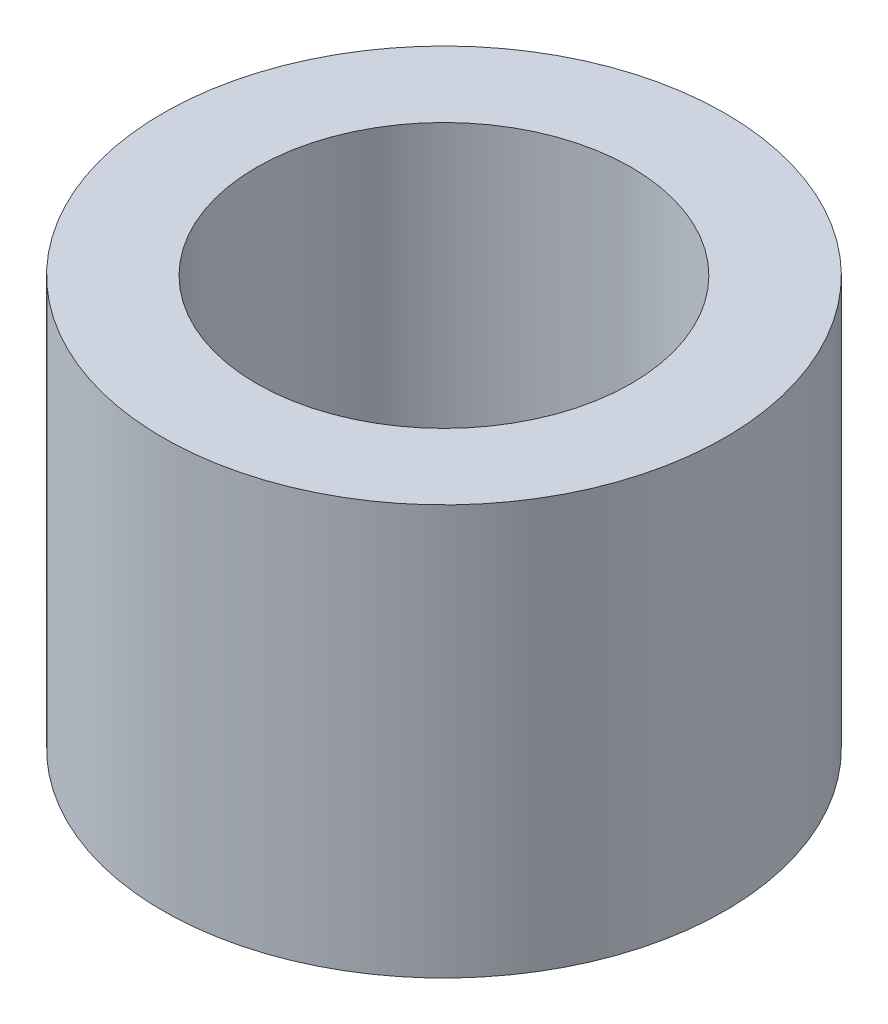
ISO-10303-21;
HEADER;
FILE_DESCRIPTION(('STEP AP214'),'2;1');
FILE_NAME('part.step','',(''),(''),'','','');
FILE_SCHEMA(('AUTOMOTIVE_DESIGN { 1 0 10303 214 1 1 1 1 }'));
ENDSEC;
DATA;
#1=APPLICATION_CONTEXT('core data for automotive mechanical design processes');
#2=APPLICATION_PROTOCOL_DEFINITION('international standard','automotive_design',2000,#1);
#3=PRODUCT_CONTEXT('',#1,'mechanical');
#4=PRODUCT('Part','Part','',(#3));
#5=PRODUCT_RELATED_PRODUCT_CATEGORY('part','',(#4));
#6=PRODUCT_DEFINITION_FORMATION('','',#4);
#7=PRODUCT_DEFINITION_CONTEXT('part definition',#1,'design');
#8=PRODUCT_DEFINITION('design','',#6,#7);
#9=PRODUCT_DEFINITION_SHAPE('','',#8);
#10=(LENGTH_UNIT() NAMED_UNIT(*) SI_UNIT(.MILLI.,.METRE.));
#11=(NAMED_UNIT(*) PLANE_ANGLE_UNIT() SI_UNIT($,.RADIAN.));
#12=(NAMED_UNIT(*) SI_UNIT($,.STERADIAN.) SOLID_ANGLE_UNIT());
#13=UNCERTAINTY_MEASURE_WITH_UNIT(LENGTH_MEASURE(1.E-05),#10,'distance_accuracy_value','');
#14=(GEOMETRIC_REPRESENTATION_CONTEXT(3) GLOBAL_UNCERTAINTY_ASSIGNED_CONTEXT((#13)) GLOBAL_UNIT_ASSIGNED_CONTEXT((#10,
#11,#12)) REPRESENTATION_CONTEXT('',''));
#15=CARTESIAN_POINT('',(0.,0.,0.));
#16=DIRECTION('',(0.,0.,1.));
#17=DIRECTION('',(1.,0.,0.));
#18=AXIS2_PLACEMENT_3D('',#15,#16,#17);
#19=CARTESIAN_POINT('',(0.,3.5,0.));
#20=DIRECTION('',(0.,1.,0.));
#21=DIRECTION('',(0.,0.,-1.));
#22=AXIS2_PLACEMENT_3D('',#19,#20,#21);
#23=PLANE('',#22);
#24=CARTESIAN_POINT('',(0.,3.5,0.));
#25=DIRECTION('',(0.,-1.,0.));
#26=DIRECTION('',(0.,0.,-1.));
#27=AXIS2_PLACEMENT_3D('',#24,#25,#26);
#28=CIRCLE('',#27,2.4);
#29=CARTESIAN_POINT('',(0.,3.5,-2.4));
#30=VERTEX_POINT('',#29);
#31=EDGE_CURVE('E10',#30,#30,#28,.T.);
#32=ORIENTED_EDGE('',*,*,#31,.F.);
#33=EDGE_LOOP('',(#32));
#34=FACE_BOUND('',#33,.T.);
#35=CARTESIAN_POINT('',(0.,3.5,0.));
#36=DIRECTION('',(0.,-1.,0.));
#37=DIRECTION('',(0.,0.,-1.));
#38=AXIS2_PLACEMENT_3D('',#35,#36,#37);
#39=CIRCLE('',#38,1.6);
#40=CARTESIAN_POINT('',(0.,3.5,-1.6));
#41=VERTEX_POINT('',#40);
#42=EDGE_CURVE('E52',#41,#41,#39,.T.);
#43=ORIENTED_EDGE('',*,*,#42,.T.);
#44=EDGE_LOOP('',(#43));
#45=FACE_BOUND('',#44,.T.);
#46=ADVANCED_FACE('F41',(#34,#45),#23,.T.);
#47=CARTESIAN_POINT('',(0.,0.,0.));
#48=DIRECTION('',(0.,1.,0.));
#49=DIRECTION('',(0.,0.,-1.));
#50=AXIS2_PLACEMENT_3D('',#47,#48,#49);
#51=PLANE('',#50);
#52=CARTESIAN_POINT('',(0.,0.,0.));
#53=DIRECTION('',(0.,-1.,0.));
#54=DIRECTION('',(0.,0.,-1.));
#55=AXIS2_PLACEMENT_3D('',#52,#53,#54);
#56=CIRCLE('',#55,2.4);
#57=CARTESIAN_POINT('',(0.,0.,-2.4));
#58=VERTEX_POINT('',#57);
#59=EDGE_CURVE('E45',#58,#58,#56,.T.);
#60=ORIENTED_EDGE('',*,*,#59,.T.);
#61=EDGE_LOOP('',(#60));
#62=FACE_BOUND('',#61,.T.);
#63=CARTESIAN_POINT('',(0.,0.,0.));
#64=DIRECTION('',(0.,-1.,0.));
#65=DIRECTION('',(0.,0.,-1.));
#66=AXIS2_PLACEMENT_3D('',#63,#64,#65);
#67=CIRCLE('',#66,1.6);
#68=CARTESIAN_POINT('',(0.,0.,-1.6));
#69=VERTEX_POINT('',#68);
#70=EDGE_CURVE('E54',#69,#69,#67,.T.);
#71=ORIENTED_EDGE('',*,*,#70,.F.);
#72=EDGE_LOOP('',(#71));
#73=FACE_BOUND('',#72,.T.);
#74=ADVANCED_FACE('F67',(#62,#73),#51,.F.);
#75=CARTESIAN_POINT('',(0.,3.5,0.));
#76=DIRECTION('',(0.,-1.,0.));
#77=DIRECTION('',(0.,0.,1.));
#78=AXIS2_PLACEMENT_3D('',#75,#76,#77);
#79=CYLINDRICAL_SURFACE('',#78,2.4);
#80=ORIENTED_EDGE('',*,*,#31,.T.);
#81=EDGE_LOOP('',(#80));
#82=FACE_BOUND('',#81,.T.);
#83=ORIENTED_EDGE('',*,*,#59,.F.);
#84=EDGE_LOOP('',(#83));
#85=FACE_BOUND('',#84,.T.);
#86=ADVANCED_FACE('F43',(#82,#85),#79,.T.);
#87=CARTESIAN_POINT('',(0.,3.5,0.));
#88=DIRECTION('',(0.,-1.,0.));
#89=DIRECTION('',(0.,0.,1.));
#90=AXIS2_PLACEMENT_3D('',#87,#88,#89);
#91=CYLINDRICAL_SURFACE('',#90,1.6);
#92=ORIENTED_EDGE('',*,*,#42,.F.);
#93=EDGE_LOOP('',(#92));
#94=FACE_BOUND('',#93,.T.);
#95=ORIENTED_EDGE('',*,*,#70,.T.);
#96=EDGE_LOOP('',(#95));
#97=FACE_BOUND('',#96,.T.);
#98=ADVANCED_FACE('F61',(#94,#97),#91,.F.);
#99=CLOSED_SHELL('',(#46,#74,#86,#98));
#100=MANIFOLD_SOLID_BREP('B2',#99);
#101=ADVANCED_BREP_SHAPE_REPRESENTATION('',(#18,#100),#14);
#102=SHAPE_DEFINITION_REPRESENTATION(#9,#101);
ENDSEC;
END-ISO-10303-21;
